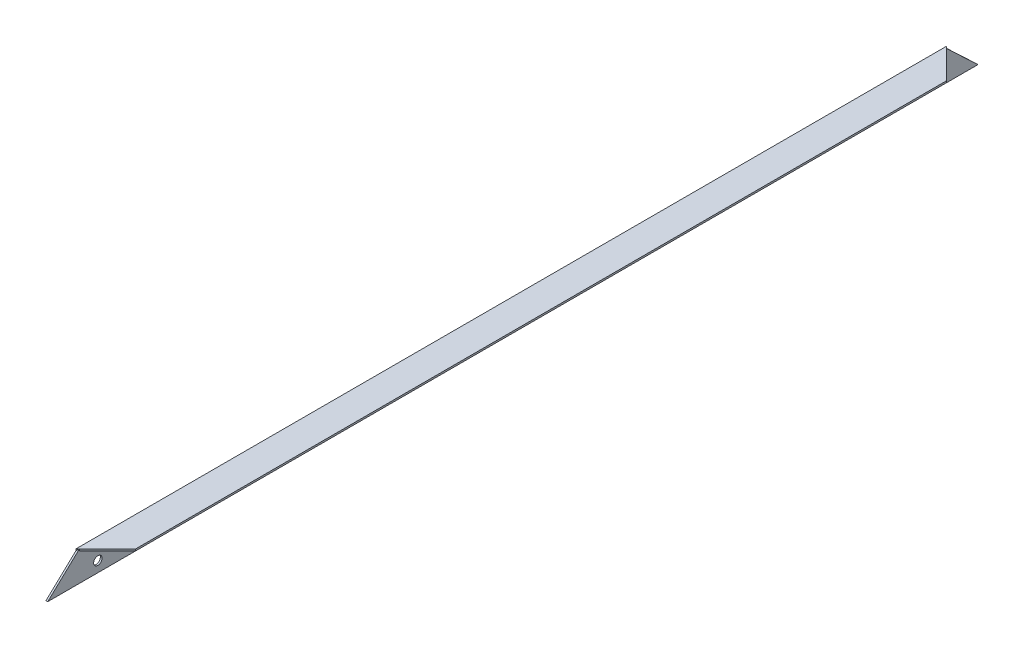
ISO-10303-21;
HEADER;
FILE_DESCRIPTION(('STEP AP214'),'2;1');
FILE_NAME('part.step','',(''),(''),'','','');
FILE_SCHEMA(('AUTOMOTIVE_DESIGN { 1 0 10303 214 1 1 1 1 }'));
ENDSEC;
DATA;
#1=APPLICATION_CONTEXT('core data for automotive mechanical design processes');
#2=APPLICATION_PROTOCOL_DEFINITION('international standard','automotive_design',2000,#1);
#3=PRODUCT_CONTEXT('',#1,'mechanical');
#4=PRODUCT('Part','Part','',(#3));
#5=PRODUCT_RELATED_PRODUCT_CATEGORY('part','',(#4));
#6=PRODUCT_DEFINITION_FORMATION('','',#4);
#7=PRODUCT_DEFINITION_CONTEXT('part definition',#1,'design');
#8=PRODUCT_DEFINITION('design','',#6,#7);
#9=PRODUCT_DEFINITION_SHAPE('','',#8);
#10=(LENGTH_UNIT() NAMED_UNIT(*) SI_UNIT(.MILLI.,.METRE.));
#11=(NAMED_UNIT(*) PLANE_ANGLE_UNIT() SI_UNIT($,.RADIAN.));
#12=(NAMED_UNIT(*) SI_UNIT($,.STERADIAN.) SOLID_ANGLE_UNIT());
#13=UNCERTAINTY_MEASURE_WITH_UNIT(LENGTH_MEASURE(1.E-05),#10,'distance_accuracy_value','');
#14=(GEOMETRIC_REPRESENTATION_CONTEXT(3) GLOBAL_UNCERTAINTY_ASSIGNED_CONTEXT((#13)) GLOBAL_UNIT_ASSIGNED_CONTEXT((#10,
#11,#12)) REPRESENTATION_CONTEXT('',''));
#15=CARTESIAN_POINT('',(0.,0.,0.));
#16=DIRECTION('',(0.,0.,1.));
#17=DIRECTION('',(1.,0.,0.));
#18=AXIS2_PLACEMENT_3D('',#15,#16,#17);
#19=CARTESIAN_POINT('',(-17.9063367596535,10.1835053553727,-618.75));
#20=DIRECTION('',(-0.707106781186547,0.,0.707106781186548));
#21=DIRECTION('',(0.707106781186548,0.,0.707106781186547));
#22=AXIS2_PLACEMENT_3D('',#19,#20,#21);
#23=PLANE('',#22);
#24=DIRECTION('',(0.,-1.,0.));
#25=VECTOR('',#24,1.);
#26=CARTESIAN_POINT('',(-15.4063367596535,20.1835053553728,-616.25));
#27=LINE('',#26,#25);
#28=CARTESIAN_POINT('',(-15.4063367596535,20.1835053553728,-616.25));
#29=VERTEX_POINT('',#28);
#30=CARTESIAN_POINT('',(-15.4063367596535,17.6835053553727,-616.25));
#31=VERTEX_POINT('',#30);
#32=EDGE_CURVE('E126',#29,#31,#27,.T.);
#33=ORIENTED_EDGE('',*,*,#32,.F.);
#34=DIRECTION('',(0.707106781186548,0.,0.707106781186547));
#35=VECTOR('',#34,1.);
#36=CARTESIAN_POINT('',(-17.9063367596535,20.1835053553727,-618.75));
#37=LINE('',#36,#35);
#38=CARTESIAN_POINT('',(24.5936632403465,20.1835053553727,-576.25));
#39=VERTEX_POINT('',#38);
#40=EDGE_CURVE('E144',#29,#39,#37,.T.);
#41=ORIENTED_EDGE('',*,*,#40,.T.);
#42=DIRECTION('',(0.,1.,0.));
#43=VECTOR('',#42,1.);
#44=CARTESIAN_POINT('',(24.5936632403465,10.1835053553728,-576.25));
#45=LINE('',#44,#43);
#46=CARTESIAN_POINT('',(24.5936632403465,17.6835053553727,-576.25));
#47=VERTEX_POINT('',#46);
#48=EDGE_CURVE('E58',#47,#39,#45,.T.);
#49=ORIENTED_EDGE('',*,*,#48,.F.);
#50=DIRECTION('',(0.707106781186548,0.,0.707106781186547));
#51=VECTOR('',#50,1.);
#52=CARTESIAN_POINT('',(602.093663240347,17.6835053553727,1.24999999999964));
#53=LINE('',#52,#51);
#54=EDGE_CURVE('E146',#31,#47,#53,.T.);
#55=ORIENTED_EDGE('',*,*,#54,.F.);
#56=EDGE_LOOP('',(#33,#41,#49,#55));
#57=FACE_BOUND('',#56,.T.);
#58=ADVANCED_FACE('F35',(#57),#23,.F.);
#59=CARTESIAN_POINT('',(-17.9063367596535,10.1835053553727,618.75));
#60=DIRECTION('',(-0.707106781186547,0.,-0.707106781186548));
#61=DIRECTION('',(-0.707106781186548,0.,0.707106781186547));
#62=AXIS2_PLACEMENT_3D('',#59,#60,#61);
#63=PLANE('',#62);
#64=DIRECTION('',(0.,-1.,0.));
#65=VECTOR('',#64,1.);
#66=CARTESIAN_POINT('',(-17.9063367596535,20.1835053553727,618.75));
#67=LINE('',#66,#65);
#68=CARTESIAN_POINT('',(-17.9063367596535,20.1835053553727,618.75));
#69=VERTEX_POINT('',#68);
#70=CARTESIAN_POINT('',(-17.9063367596535,17.8223942442616,618.75));
#71=VERTEX_POINT('',#70);
#72=EDGE_CURVE('E112',#69,#71,#67,.T.);
#73=ORIENTED_EDGE('',*,*,#72,.T.);
#74=DIRECTION('',(0.588034368346322,0.55536579232708,-0.588034368346322));
#75=VECTOR('',#74,1.);
#76=CARTESIAN_POINT('',(-20.4010005803579,15.4663228580408,621.244663820704));
#77=LINE('',#76,#75);
#78=CARTESIAN_POINT('',(-15.4063367596535,20.1835053553727,616.25));
#79=VERTEX_POINT('',#78);
#80=EDGE_CURVE('E43',#71,#79,#77,.T.);
#81=ORIENTED_EDGE('',*,*,#80,.T.);
#82=DIRECTION('',(-0.707106781186548,0.,0.707106781186547));
#83=VECTOR('',#82,1.);
#84=CARTESIAN_POINT('',(-17.9063367596535,20.1835053553727,618.75));
#85=LINE('',#84,#83);
#86=EDGE_CURVE('E140',#79,#69,#85,.T.);
#87=ORIENTED_EDGE('',*,*,#86,.T.);
#88=EDGE_LOOP('',(#73,#81,#87));
#89=FACE_BOUND('',#88,.T.);
#90=ADVANCED_FACE('F171',(#89),#63,.F.);
#91=CARTESIAN_POINT('',(-17.9063367596535,-22.3164946446273,618.75));
#92=DIRECTION('',(0.,1.,0.));
#93=DIRECTION('',(0.,0.,1.));
#94=AXIS2_PLACEMENT_3D('',#91,#92,#93);
#95=PLANE('',#94);
#96=DIRECTION('',(0.,0.,-1.));
#97=VECTOR('',#96,1.);
#98=CARTESIAN_POINT('',(-17.9063367596535,-22.3164946446273,618.75));
#99=LINE('',#98,#97);
#100=CARTESIAN_POINT('',(-17.9063367596535,-22.3164946446273,661.25));
#101=VERTEX_POINT('',#100);
#102=CARTESIAN_POINT('',(-17.9063367596535,-22.3164946446271,-661.25));
#103=VERTEX_POINT('',#102);
#104=EDGE_CURVE('E101',#101,#103,#99,.T.);
#105=ORIENTED_EDGE('',*,*,#104,.T.);
#106=DIRECTION('',(1.,0.,0.));
#107=VECTOR('',#106,1.);
#108=CARTESIAN_POINT('',(-17.9063367596535,-22.3164946446271,-661.25));
#109=LINE('',#108,#107);
#110=CARTESIAN_POINT('',(-15.4063367596535,-22.3164946446271,-661.25));
#111=VERTEX_POINT('',#110);
#112=EDGE_CURVE('E103',#103,#111,#109,.T.);
#113=ORIENTED_EDGE('',*,*,#112,.T.);
#114=DIRECTION('',(0.,0.,-1.));
#115=VECTOR('',#114,1.);
#116=CARTESIAN_POINT('',(-15.4063367596535,-22.3164946446273,618.75));
#117=LINE('',#116,#115);
#118=CARTESIAN_POINT('',(-15.4063367596535,-22.3164946446273,661.25));
#119=VERTEX_POINT('',#118);
#120=EDGE_CURVE('E167',#119,#111,#117,.T.);
#121=ORIENTED_EDGE('',*,*,#120,.F.);
#122=DIRECTION('',(1.,0.,0.));
#123=VECTOR('',#122,1.);
#124=CARTESIAN_POINT('',(-17.9063367596535,-22.3164946446273,661.25));
#125=LINE('',#124,#123);
#126=EDGE_CURVE('E106',#101,#119,#125,.T.);
#127=ORIENTED_EDGE('',*,*,#126,.F.);
#128=EDGE_LOOP('',(#105,#113,#121,#127));
#129=FACE_BOUND('',#128,.T.);
#130=ADVANCED_FACE('F37',(#129),#95,.F.);
#131=CARTESIAN_POINT('',(-15.4063367596535,-22.3164946446273,618.75));
#132=DIRECTION('',(-1.,0.,0.));
#133=DIRECTION('',(0.,-1.,0.));
#134=AXIS2_PLACEMENT_3D('',#131,#132,#133);
#135=PLANE('',#134);
#136=CARTESIAN_POINT('',(-15.4063367596535,-7.31649464462725,590.));
#137=DIRECTION('',(-1.,0.,0.));
#138=DIRECTION('',(0.,-1.,0.));
#139=AXIS2_PLACEMENT_3D('',#136,#137,#138);
#140=CIRCLE('',#139,5.99999999999999);
#141=CARTESIAN_POINT('',(-15.4063367596535,-13.3164946446272,590.));
#142=VERTEX_POINT('',#141);
#143=EDGE_CURVE('E130',#142,#142,#140,.T.);
#144=ORIENTED_EDGE('',*,*,#143,.T.);
#145=EDGE_LOOP('',(#144));
#146=FACE_BOUND('',#145,.T.);
#147=CARTESIAN_POINT('',(-15.4063367596535,-7.31649464462725,472.));
#148=DIRECTION('',(-1.,0.,0.));
#149=DIRECTION('',(0.,-1.,0.));
#150=AXIS2_PLACEMENT_3D('',#147,#148,#149);
#151=CIRCLE('',#150,5.99999999999999);
#152=CARTESIAN_POINT('',(-15.4063367596535,-13.3164946446272,472.));
#153=VERTEX_POINT('',#152);
#154=EDGE_CURVE('E236',#153,#153,#151,.T.);
#155=ORIENTED_EDGE('',*,*,#154,.T.);
#156=EDGE_LOOP('',(#155));
#157=FACE_BOUND('',#156,.T.);
#158=CARTESIAN_POINT('',(-15.4063367596535,-7.31649464462725,354.));
#159=DIRECTION('',(-1.,0.,0.));
#160=DIRECTION('',(0.,-1.,0.));
#161=AXIS2_PLACEMENT_3D('',#158,#159,#160);
#162=CIRCLE('',#161,5.99999999999999);
#163=CARTESIAN_POINT('',(-15.4063367596535,-13.3164946446272,354.));
#164=VERTEX_POINT('',#163);
#165=EDGE_CURVE('E240',#164,#164,#162,.T.);
#166=ORIENTED_EDGE('',*,*,#165,.T.);
#167=EDGE_LOOP('',(#166));
#168=FACE_BOUND('',#167,.T.);
#169=CARTESIAN_POINT('',(-15.4063367596535,-7.31649464462725,236.));
#170=DIRECTION('',(-1.,0.,0.));
#171=DIRECTION('',(0.,-1.,0.));
#172=AXIS2_PLACEMENT_3D('',#169,#170,#171);
#173=CIRCLE('',#172,5.99999999999999);
#174=CARTESIAN_POINT('',(-15.4063367596535,-13.3164946446272,236.));
#175=VERTEX_POINT('',#174);
#176=EDGE_CURVE('E244',#175,#175,#173,.T.);
#177=ORIENTED_EDGE('',*,*,#176,.T.);
#178=EDGE_LOOP('',(#177));
#179=FACE_BOUND('',#178,.T.);
#180=CARTESIAN_POINT('',(-15.4063367596535,-7.31649464462725,118.));
#181=DIRECTION('',(-1.,0.,0.));
#182=DIRECTION('',(0.,-1.,0.));
#183=AXIS2_PLACEMENT_3D('',#180,#181,#182);
#184=CIRCLE('',#183,5.99999999999999);
#185=CARTESIAN_POINT('',(-15.4063367596535,-13.3164946446272,118.));
#186=VERTEX_POINT('',#185);
#187=EDGE_CURVE('E248',#186,#186,#184,.T.);
#188=ORIENTED_EDGE('',*,*,#187,.T.);
#189=EDGE_LOOP('',(#188));
#190=FACE_BOUND('',#189,.T.);
#191=CARTESIAN_POINT('',(-15.4063367596535,-7.31649464462725,0.));
#192=DIRECTION('',(-1.,0.,0.));
#193=DIRECTION('',(0.,-1.,0.));
#194=AXIS2_PLACEMENT_3D('',#191,#192,#193);
#195=CIRCLE('',#194,5.99999999999999);
#196=CARTESIAN_POINT('',(-15.4063367596535,-13.3164946446272,0.));
#197=VERTEX_POINT('',#196);
#198=EDGE_CURVE('E252',#197,#197,#195,.T.);
#199=ORIENTED_EDGE('',*,*,#198,.T.);
#200=EDGE_LOOP('',(#199));
#201=FACE_BOUND('',#200,.T.);
#202=CARTESIAN_POINT('',(-15.4063367596535,-7.31649464462725,-118.));
#203=DIRECTION('',(-1.,0.,0.));
#204=DIRECTION('',(0.,-1.,0.));
#205=AXIS2_PLACEMENT_3D('',#202,#203,#204);
#206=CIRCLE('',#205,5.99999999999999);
#207=CARTESIAN_POINT('',(-15.4063367596535,-13.3164946446272,-118.));
#208=VERTEX_POINT('',#207);
#209=EDGE_CURVE('E256',#208,#208,#206,.T.);
#210=ORIENTED_EDGE('',*,*,#209,.T.);
#211=EDGE_LOOP('',(#210));
#212=FACE_BOUND('',#211,.T.);
#213=CARTESIAN_POINT('',(-15.4063367596535,-7.31649464462725,-236.));
#214=DIRECTION('',(-1.,0.,0.));
#215=DIRECTION('',(0.,-1.,0.));
#216=AXIS2_PLACEMENT_3D('',#213,#214,#215);
#217=CIRCLE('',#216,5.99999999999999);
#218=CARTESIAN_POINT('',(-15.4063367596535,-13.3164946446272,-236.));
#219=VERTEX_POINT('',#218);
#220=EDGE_CURVE('E260',#219,#219,#217,.T.);
#221=ORIENTED_EDGE('',*,*,#220,.T.);
#222=EDGE_LOOP('',(#221));
#223=FACE_BOUND('',#222,.T.);
#224=CARTESIAN_POINT('',(-15.4063367596535,-7.31649464462725,-354.));
#225=DIRECTION('',(-1.,0.,0.));
#226=DIRECTION('',(0.,-1.,0.));
#227=AXIS2_PLACEMENT_3D('',#224,#225,#226);
#228=CIRCLE('',#227,5.99999999999999);
#229=CARTESIAN_POINT('',(-15.4063367596535,-13.3164946446272,-354.));
#230=VERTEX_POINT('',#229);
#231=EDGE_CURVE('E264',#230,#230,#228,.T.);
#232=ORIENTED_EDGE('',*,*,#231,.T.);
#233=EDGE_LOOP('',(#232));
#234=FACE_BOUND('',#233,.T.);
#235=CARTESIAN_POINT('',(-15.4063367596535,-7.31649464462725,-472.));
#236=DIRECTION('',(-1.,0.,0.));
#237=DIRECTION('',(0.,-1.,0.));
#238=AXIS2_PLACEMENT_3D('',#235,#236,#237);
#239=CIRCLE('',#238,5.99999999999999);
#240=CARTESIAN_POINT('',(-15.4063367596535,-13.3164946446272,-472.));
#241=VERTEX_POINT('',#240);
#242=EDGE_CURVE('E268',#241,#241,#239,.T.);
#243=ORIENTED_EDGE('',*,*,#242,.T.);
#244=EDGE_LOOP('',(#243));
#245=FACE_BOUND('',#244,.T.);
#246=CARTESIAN_POINT('',(-15.4063367596535,-7.31649464462725,-590.));
#247=DIRECTION('',(-1.,0.,0.));
#248=DIRECTION('',(0.,-1.,0.));
#249=AXIS2_PLACEMENT_3D('',#246,#247,#248);
#250=CIRCLE('',#249,5.99999999999999);
#251=CARTESIAN_POINT('',(-15.4063367596535,-13.3164946446272,-590.));
#252=VERTEX_POINT('',#251);
#253=EDGE_CURVE('E271',#252,#252,#250,.T.);
#254=ORIENTED_EDGE('',*,*,#253,.T.);
#255=EDGE_LOOP('',(#254));
#256=FACE_BOUND('',#255,.T.);
#257=ORIENTED_EDGE('',*,*,#120,.T.);
#258=DIRECTION('',(0.,0.686623532963715,0.727013152549818));
#259=VECTOR('',#258,1.);
#260=CARTESIAN_POINT('',(-15.4063367596535,20.1835053553728,-616.25));
#261=LINE('',#260,#259);
#262=EDGE_CURVE('E118',#111,#29,#261,.T.);
#263=ORIENTED_EDGE('',*,*,#262,.T.);
#264=ORIENTED_EDGE('',*,*,#32,.T.);
#265=DIRECTION('',(0.,0.,-1.));
#266=VECTOR('',#265,1.);
#267=CARTESIAN_POINT('',(-15.4063367596535,17.6835053553727,618.75));
#268=LINE('',#267,#266);
#269=CARTESIAN_POINT('',(-15.4063367596535,17.6835053553727,616.25));
#270=VERTEX_POINT('',#269);
#271=EDGE_CURVE('E164',#270,#31,#268,.T.);
#272=ORIENTED_EDGE('',*,*,#271,.F.);
#273=DIRECTION('',(0.,1.,0.));
#274=VECTOR('',#273,1.);
#275=CARTESIAN_POINT('',(-15.4063367596535,20.1835053553727,616.25));
#276=LINE('',#275,#274);
#277=EDGE_CURVE('E119',#270,#79,#276,.T.);
#278=ORIENTED_EDGE('',*,*,#277,.T.);
#279=DIRECTION('',(0.,-0.686623532963716,0.727013152549818));
#280=VECTOR('',#279,1.);
#281=CARTESIAN_POINT('',(-15.4063367596535,20.1835053553727,616.25));
#282=LINE('',#281,#280);
#283=EDGE_CURVE('E135',#79,#119,#282,.T.);
#284=ORIENTED_EDGE('',*,*,#283,.T.);
#285=EDGE_LOOP('',(#257,#263,#264,#272,#278,#284));
#286=FACE_BOUND('',#285,.T.);
#287=ADVANCED_FACE('F193',(#146,#157,#168,#179,#190,#201,#212,#223,#234,#245,#256,#286),#135,.F.);
#288=CARTESIAN_POINT('',(-15.4063367596535,17.6835053553727,618.75));
#289=DIRECTION('',(0.,1.,0.));
#290=DIRECTION('',(0.,0.,1.));
#291=AXIS2_PLACEMENT_3D('',#288,#289,#290);
#292=PLANE('',#291);
#293=ORIENTED_EDGE('',*,*,#271,.T.);
#294=ORIENTED_EDGE('',*,*,#54,.T.);
#295=DIRECTION('',(0.,0.,-1.));
#296=VECTOR('',#295,1.);
#297=CARTESIAN_POINT('',(24.5936632403465,17.6835053553727,618.75));
#298=LINE('',#297,#296);
#299=CARTESIAN_POINT('',(24.5936632403465,17.6835053553727,576.25));
#300=VERTEX_POINT('',#299);
#301=EDGE_CURVE('E161',#300,#47,#298,.T.);
#302=ORIENTED_EDGE('',*,*,#301,.F.);
#303=DIRECTION('',(-0.707106781186548,0.,0.707106781186547));
#304=VECTOR('',#303,1.);
#305=CARTESIAN_POINT('',(-16.6563367596535,17.6835053553727,617.5));
#306=LINE('',#305,#304);
#307=EDGE_CURVE('E50',#300,#270,#306,.T.);
#308=ORIENTED_EDGE('',*,*,#307,.T.);
#309=EDGE_LOOP('',(#293,#294,#302,#308));
#310=FACE_BOUND('',#309,.T.);
#311=ADVANCED_FACE('F186',(#310),#292,.F.);
#312=CARTESIAN_POINT('',(24.5936632403465,17.6835053553727,618.75));
#313=DIRECTION('',(-1.,0.,0.));
#314=DIRECTION('',(0.,0.,1.));
#315=AXIS2_PLACEMENT_3D('',#312,#313,#314);
#316=PLANE('',#315);
#317=ORIENTED_EDGE('',*,*,#301,.T.);
#318=ORIENTED_EDGE('',*,*,#48,.T.);
#319=DIRECTION('',(0.,0.,-1.));
#320=VECTOR('',#319,1.);
#321=CARTESIAN_POINT('',(24.5936632403465,20.1835053553727,618.75));
#322=LINE('',#321,#320);
#323=CARTESIAN_POINT('',(24.5936632403465,20.1835053553727,576.25));
#324=VERTEX_POINT('',#323);
#325=EDGE_CURVE('E158',#324,#39,#322,.T.);
#326=ORIENTED_EDGE('',*,*,#325,.F.);
#327=DIRECTION('',(0.,1.,0.));
#328=VECTOR('',#327,1.);
#329=CARTESIAN_POINT('',(24.5936632403465,10.1835053553728,576.25));
#330=LINE('',#329,#328);
#331=EDGE_CURVE('E150',#300,#324,#330,.T.);
#332=ORIENTED_EDGE('',*,*,#331,.F.);
#333=EDGE_LOOP('',(#317,#318,#326,#332));
#334=FACE_BOUND('',#333,.T.);
#335=ADVANCED_FACE('F184',(#334),#316,.F.);
#336=CARTESIAN_POINT('',(24.5936632403465,20.1835053553727,618.75));
#337=DIRECTION('',(0.,-1.,0.));
#338=DIRECTION('',(1.,0.,0.));
#339=AXIS2_PLACEMENT_3D('',#336,#337,#338);
#340=PLANE('',#339);
#341=CARTESIAN_POINT('',(-17.9063367596535,20.1835053553727,-618.75));
#342=VERTEX_POINT('',#341);
#343=EDGE_CURVE('E141',#342,#29,#37,.T.);
#344=ORIENTED_EDGE('',*,*,#343,.F.);
#345=DIRECTION('',(0.,0.,-1.));
#346=VECTOR('',#345,1.);
#347=CARTESIAN_POINT('',(-17.9063367596535,20.1835053553727,618.75));
#348=LINE('',#347,#346);
#349=EDGE_CURVE('E111',#69,#342,#348,.T.);
#350=ORIENTED_EDGE('',*,*,#349,.F.);
#351=ORIENTED_EDGE('',*,*,#86,.F.);
#352=EDGE_CURVE('E147',#324,#79,#85,.T.);
#353=ORIENTED_EDGE('',*,*,#352,.F.);
#354=ORIENTED_EDGE('',*,*,#325,.T.);
#355=ORIENTED_EDGE('',*,*,#40,.F.);
#356=EDGE_LOOP('',(#344,#350,#351,#353,#354,#355));
#357=FACE_BOUND('',#356,.T.);
#358=ADVANCED_FACE('F179',(#357),#340,.F.);
#359=CARTESIAN_POINT('',(-17.9063367596535,20.1835053553727,618.75));
#360=DIRECTION('',(1.,0.,0.));
#361=DIRECTION('',(0.,1.,0.));
#362=AXIS2_PLACEMENT_3D('',#359,#360,#361);
#363=PLANE('',#362);
#364=CARTESIAN_POINT('',(-17.9063367596535,-7.31649464462725,590.));
#365=DIRECTION('',(1.,0.,0.));
#366=DIRECTION('',(0.,1.,0.));
#367=AXIS2_PLACEMENT_3D('',#364,#365,#366);
#368=CIRCLE('',#367,5.99999999999999);
#369=CARTESIAN_POINT('',(-17.9063367596535,-1.31649464462726,590.));
#370=VERTEX_POINT('',#369);
#371=EDGE_CURVE('E273',#370,#370,#368,.T.);
#372=ORIENTED_EDGE('',*,*,#371,.T.);
#373=EDGE_LOOP('',(#372));
#374=FACE_BOUND('',#373,.T.);
#375=CARTESIAN_POINT('',(-17.9063367596535,-7.31649464462725,472.));
#376=DIRECTION('',(1.,0.,0.));
#377=DIRECTION('',(0.,1.,0.));
#378=AXIS2_PLACEMENT_3D('',#375,#376,#377);
#379=CIRCLE('',#378,5.99999999999999);
#380=CARTESIAN_POINT('',(-17.9063367596535,-1.31649464462726,472.));
#381=VERTEX_POINT('',#380);
#382=EDGE_CURVE('E276',#381,#381,#379,.T.);
#383=ORIENTED_EDGE('',*,*,#382,.T.);
#384=EDGE_LOOP('',(#383));
#385=FACE_BOUND('',#384,.T.);
#386=CARTESIAN_POINT('',(-17.9063367596535,-7.31649464462725,354.));
#387=DIRECTION('',(1.,0.,0.));
#388=DIRECTION('',(0.,1.,0.));
#389=AXIS2_PLACEMENT_3D('',#386,#387,#388);
#390=CIRCLE('',#389,5.99999999999999);
#391=CARTESIAN_POINT('',(-17.9063367596535,-1.31649464462726,354.));
#392=VERTEX_POINT('',#391);
#393=EDGE_CURVE('E310',#392,#392,#390,.T.);
#394=ORIENTED_EDGE('',*,*,#393,.T.);
#395=EDGE_LOOP('',(#394));
#396=FACE_BOUND('',#395,.T.);
#397=CARTESIAN_POINT('',(-17.9063367596535,-7.31649464462725,236.));
#398=DIRECTION('',(1.,0.,0.));
#399=DIRECTION('',(0.,1.,0.));
#400=AXIS2_PLACEMENT_3D('',#397,#398,#399);
#401=CIRCLE('',#400,5.99999999999999);
#402=CARTESIAN_POINT('',(-17.9063367596535,-1.31649464462726,236.));
#403=VERTEX_POINT('',#402);
#404=EDGE_CURVE('E307',#403,#403,#401,.T.);
#405=ORIENTED_EDGE('',*,*,#404,.T.);
#406=EDGE_LOOP('',(#405));
#407=FACE_BOUND('',#406,.T.);
#408=CARTESIAN_POINT('',(-17.9063367596535,-7.31649464462725,118.));
#409=DIRECTION('',(1.,0.,0.));
#410=DIRECTION('',(0.,1.,0.));
#411=AXIS2_PLACEMENT_3D('',#408,#409,#410);
#412=CIRCLE('',#411,5.99999999999999);
#413=CARTESIAN_POINT('',(-17.9063367596535,-1.31649464462726,118.));
#414=VERTEX_POINT('',#413);
#415=EDGE_CURVE('E304',#414,#414,#412,.T.);
#416=ORIENTED_EDGE('',*,*,#415,.T.);
#417=EDGE_LOOP('',(#416));
#418=FACE_BOUND('',#417,.T.);
#419=CARTESIAN_POINT('',(-17.9063367596535,-7.31649464462725,0.));
#420=DIRECTION('',(1.,0.,0.));
#421=DIRECTION('',(0.,1.,0.));
#422=AXIS2_PLACEMENT_3D('',#419,#420,#421);
#423=CIRCLE('',#422,5.99999999999999);
#424=CARTESIAN_POINT('',(-17.9063367596535,-1.31649464462726,0.));
#425=VERTEX_POINT('',#424);
#426=EDGE_CURVE('E301',#425,#425,#423,.T.);
#427=ORIENTED_EDGE('',*,*,#426,.T.);
#428=EDGE_LOOP('',(#427));
#429=FACE_BOUND('',#428,.T.);
#430=CARTESIAN_POINT('',(-17.9063367596535,-7.31649464462725,-118.));
#431=DIRECTION('',(1.,0.,0.));
#432=DIRECTION('',(0.,1.,0.));
#433=AXIS2_PLACEMENT_3D('',#430,#431,#432);
#434=CIRCLE('',#433,5.99999999999999);
#435=CARTESIAN_POINT('',(-17.9063367596535,-1.31649464462726,-118.));
#436=VERTEX_POINT('',#435);
#437=EDGE_CURVE('E298',#436,#436,#434,.T.);
#438=ORIENTED_EDGE('',*,*,#437,.T.);
#439=EDGE_LOOP('',(#438));
#440=FACE_BOUND('',#439,.T.);
#441=CARTESIAN_POINT('',(-17.9063367596535,-7.31649464462725,-236.));
#442=DIRECTION('',(1.,0.,0.));
#443=DIRECTION('',(0.,1.,0.));
#444=AXIS2_PLACEMENT_3D('',#441,#442,#443);
#445=CIRCLE('',#444,5.99999999999999);
#446=CARTESIAN_POINT('',(-17.9063367596535,-1.31649464462726,-236.));
#447=VERTEX_POINT('',#446);
#448=EDGE_CURVE('E295',#447,#447,#445,.T.);
#449=ORIENTED_EDGE('',*,*,#448,.T.);
#450=EDGE_LOOP('',(#449));
#451=FACE_BOUND('',#450,.T.);
#452=CARTESIAN_POINT('',(-17.9063367596535,-7.31649464462725,-354.));
#453=DIRECTION('',(1.,0.,0.));
#454=DIRECTION('',(0.,1.,0.));
#455=AXIS2_PLACEMENT_3D('',#452,#453,#454);
#456=CIRCLE('',#455,5.99999999999999);
#457=CARTESIAN_POINT('',(-17.9063367596535,-1.31649464462726,-354.));
#458=VERTEX_POINT('',#457);
#459=EDGE_CURVE('E292',#458,#458,#456,.T.);
#460=ORIENTED_EDGE('',*,*,#459,.T.);
#461=EDGE_LOOP('',(#460));
#462=FACE_BOUND('',#461,.T.);
#463=CARTESIAN_POINT('',(-17.9063367596535,-7.31649464462725,-472.));
#464=DIRECTION('',(1.,0.,0.));
#465=DIRECTION('',(0.,1.,0.));
#466=AXIS2_PLACEMENT_3D('',#463,#464,#465);
#467=CIRCLE('',#466,5.99999999999999);
#468=CARTESIAN_POINT('',(-17.9063367596535,-1.31649464462726,-472.));
#469=VERTEX_POINT('',#468);
#470=EDGE_CURVE('E289',#469,#469,#467,.T.);
#471=ORIENTED_EDGE('',*,*,#470,.T.);
#472=EDGE_LOOP('',(#471));
#473=FACE_BOUND('',#472,.T.);
#474=CARTESIAN_POINT('',(-17.9063367596535,-7.31649464462725,-590.));
#475=DIRECTION('',(1.,0.,0.));
#476=DIRECTION('',(0.,1.,0.));
#477=AXIS2_PLACEMENT_3D('',#474,#475,#476);
#478=CIRCLE('',#477,5.99999999999999);
#479=CARTESIAN_POINT('',(-17.9063367596535,-1.31649464462726,-590.));
#480=VERTEX_POINT('',#479);
#481=EDGE_CURVE('E279',#480,#480,#478,.T.);
#482=ORIENTED_EDGE('',*,*,#481,.T.);
#483=EDGE_LOOP('',(#482));
#484=FACE_BOUND('',#483,.T.);
#485=DIRECTION('',(0.,-1.,0.));
#486=VECTOR('',#485,1.);
#487=CARTESIAN_POINT('',(-17.9063367596535,20.1835053553727,-618.75));
#488=LINE('',#487,#486);
#489=CARTESIAN_POINT('',(-17.9063367596535,17.8223942442618,-618.75));
#490=VERTEX_POINT('',#489);
#491=EDGE_CURVE('E124',#342,#490,#488,.T.);
#492=ORIENTED_EDGE('',*,*,#491,.T.);
#493=DIRECTION('',(0.,0.686623532963715,0.727013152549818));
#494=VECTOR('',#493,1.);
#495=CARTESIAN_POINT('',(-17.9063367596535,20.1835053553728,-616.25));
#496=LINE('',#495,#494);
#497=EDGE_CURVE('E116',#103,#490,#496,.T.);
#498=ORIENTED_EDGE('',*,*,#497,.F.);
#499=ORIENTED_EDGE('',*,*,#104,.F.);
#500=DIRECTION('',(0.,-0.686623532963716,0.727013152549818));
#501=VECTOR('',#500,1.);
#502=CARTESIAN_POINT('',(-17.9063367596535,20.1835053553727,616.25));
#503=LINE('',#502,#501);
#504=EDGE_CURVE('E133',#71,#101,#503,.T.);
#505=ORIENTED_EDGE('',*,*,#504,.F.);
#506=ORIENTED_EDGE('',*,*,#72,.F.);
#507=ORIENTED_EDGE('',*,*,#349,.T.);
#508=EDGE_LOOP('',(#492,#498,#499,#505,#506,#507));
#509=FACE_BOUND('',#508,.T.);
#510=ADVANCED_FACE('F122',(#374,#385,#396,#407,#418,#429,#440,#451,#462,#473,#484,#509),#363,.F.);
#511=ORIENTED_EDGE('',*,*,#343,.T.);
#512=DIRECTION('',(-0.588034368346322,-0.55536579232708,-0.588034368346322));
#513=VECTOR('',#512,1.);
#514=CARTESIAN_POINT('',(-20.4010005803579,15.4663228580409,-621.244663820704));
#515=LINE('',#514,#513);
#516=EDGE_CURVE('E11',#29,#490,#515,.T.);
#517=ORIENTED_EDGE('',*,*,#516,.T.);
#518=ORIENTED_EDGE('',*,*,#491,.F.);
#519=EDGE_LOOP('',(#511,#517,#518));
#520=FACE_BOUND('',#519,.T.);
#521=ADVANCED_FACE('F192',(#520),#23,.F.);
#522=ORIENTED_EDGE('',*,*,#352,.T.);
#523=ORIENTED_EDGE('',*,*,#277,.F.);
#524=ORIENTED_EDGE('',*,*,#307,.F.);
#525=ORIENTED_EDGE('',*,*,#331,.T.);
#526=EDGE_LOOP('',(#522,#523,#524,#525));
#527=FACE_BOUND('',#526,.T.);
#528=ADVANCED_FACE('F181',(#527),#63,.F.);
#529=CARTESIAN_POINT('',(-17.9063367596535,20.1835053553727,616.25));
#530=DIRECTION('',(0.,0.727013152549818,0.686623532963716));
#531=DIRECTION('',(0.,-0.686623532963716,0.727013152549818));
#532=AXIS2_PLACEMENT_3D('',#529,#530,#531);
#533=PLANE('',#532);
#534=ORIENTED_EDGE('',*,*,#80,.F.);
#535=ORIENTED_EDGE('',*,*,#504,.T.);
#536=ORIENTED_EDGE('',*,*,#126,.T.);
#537=ORIENTED_EDGE('',*,*,#283,.F.);
#538=EDGE_LOOP('',(#534,#535,#536,#537));
#539=FACE_BOUND('',#538,.T.);
#540=ADVANCED_FACE('F194',(#539),#533,.T.);
#541=CARTESIAN_POINT('',(-17.9063367596535,20.1835053553728,-616.25));
#542=DIRECTION('',(0.,0.727013152549818,-0.686623532963715));
#543=DIRECTION('',(0.,0.686623532963715,0.727013152549818));
#544=AXIS2_PLACEMENT_3D('',#541,#542,#543);
#545=PLANE('',#544);
#546=ORIENTED_EDGE('',*,*,#516,.F.);
#547=ORIENTED_EDGE('',*,*,#262,.F.);
#548=ORIENTED_EDGE('',*,*,#112,.F.);
#549=ORIENTED_EDGE('',*,*,#497,.T.);
#550=EDGE_LOOP('',(#546,#547,#548,#549));
#551=FACE_BOUND('',#550,.T.);
#552=ADVANCED_FACE('F115',(#551),#545,.T.);
#553=CARTESIAN_POINT('',(-17.9063367596535,-7.31649464462725,-590.));
#554=DIRECTION('',(1.,0.,0.));
#555=DIRECTION('',(0.,1.,0.));
#556=AXIS2_PLACEMENT_3D('',#553,#554,#555);
#557=CYLINDRICAL_SURFACE('',#556,5.99999999999999);
#558=ORIENTED_EDGE('',*,*,#481,.F.);
#559=EDGE_LOOP('',(#558));
#560=FACE_BOUND('',#559,.T.);
#561=ORIENTED_EDGE('',*,*,#253,.F.);
#562=EDGE_LOOP('',(#561));
#563=FACE_BOUND('',#562,.T.);
#564=ADVANCED_FACE('F201',(#560,#563),#557,.F.);
#565=CARTESIAN_POINT('',(-17.9063367596535,-7.31649464462725,-472.));
#566=DIRECTION('',(1.,0.,0.));
#567=DIRECTION('',(0.,1.,0.));
#568=AXIS2_PLACEMENT_3D('',#565,#566,#567);
#569=CYLINDRICAL_SURFACE('',#568,5.99999999999999);
#570=ORIENTED_EDGE('',*,*,#470,.F.);
#571=EDGE_LOOP('',(#570));
#572=FACE_BOUND('',#571,.T.);
#573=ORIENTED_EDGE('',*,*,#242,.F.);
#574=EDGE_LOOP('',(#573));
#575=FACE_BOUND('',#574,.T.);
#576=ADVANCED_FACE('F355',(#572,#575),#569,.F.);
#577=CARTESIAN_POINT('',(-17.9063367596535,-7.31649464462725,-354.));
#578=DIRECTION('',(1.,0.,0.));
#579=DIRECTION('',(0.,1.,0.));
#580=AXIS2_PLACEMENT_3D('',#577,#578,#579);
#581=CYLINDRICAL_SURFACE('',#580,5.99999999999999);
#582=ORIENTED_EDGE('',*,*,#459,.F.);
#583=EDGE_LOOP('',(#582));
#584=FACE_BOUND('',#583,.T.);
#585=ORIENTED_EDGE('',*,*,#231,.F.);
#586=EDGE_LOOP('',(#585));
#587=FACE_BOUND('',#586,.T.);
#588=ADVANCED_FACE('F351',(#584,#587),#581,.F.);
#589=CARTESIAN_POINT('',(-17.9063367596535,-7.31649464462725,-236.));
#590=DIRECTION('',(1.,0.,0.));
#591=DIRECTION('',(0.,1.,0.));
#592=AXIS2_PLACEMENT_3D('',#589,#590,#591);
#593=CYLINDRICAL_SURFACE('',#592,5.99999999999999);
#594=ORIENTED_EDGE('',*,*,#448,.F.);
#595=EDGE_LOOP('',(#594));
#596=FACE_BOUND('',#595,.T.);
#597=ORIENTED_EDGE('',*,*,#220,.F.);
#598=EDGE_LOOP('',(#597));
#599=FACE_BOUND('',#598,.T.);
#600=ADVANCED_FACE('F347',(#596,#599),#593,.F.);
#601=CARTESIAN_POINT('',(-17.9063367596535,-7.31649464462725,-118.));
#602=DIRECTION('',(1.,0.,0.));
#603=DIRECTION('',(0.,1.,0.));
#604=AXIS2_PLACEMENT_3D('',#601,#602,#603);
#605=CYLINDRICAL_SURFACE('',#604,5.99999999999999);
#606=ORIENTED_EDGE('',*,*,#437,.F.);
#607=EDGE_LOOP('',(#606));
#608=FACE_BOUND('',#607,.T.);
#609=ORIENTED_EDGE('',*,*,#209,.F.);
#610=EDGE_LOOP('',(#609));
#611=FACE_BOUND('',#610,.T.);
#612=ADVANCED_FACE('F343',(#608,#611),#605,.F.);
#613=CARTESIAN_POINT('',(-17.9063367596535,-7.31649464462725,0.));
#614=DIRECTION('',(1.,0.,0.));
#615=DIRECTION('',(0.,1.,0.));
#616=AXIS2_PLACEMENT_3D('',#613,#614,#615);
#617=CYLINDRICAL_SURFACE('',#616,5.99999999999999);
#618=ORIENTED_EDGE('',*,*,#426,.F.);
#619=EDGE_LOOP('',(#618));
#620=FACE_BOUND('',#619,.T.);
#621=ORIENTED_EDGE('',*,*,#198,.F.);
#622=EDGE_LOOP('',(#621));
#623=FACE_BOUND('',#622,.T.);
#624=ADVANCED_FACE('F339',(#620,#623),#617,.F.);
#625=CARTESIAN_POINT('',(-17.9063367596535,-7.31649464462725,118.));
#626=DIRECTION('',(1.,0.,0.));
#627=DIRECTION('',(0.,1.,0.));
#628=AXIS2_PLACEMENT_3D('',#625,#626,#627);
#629=CYLINDRICAL_SURFACE('',#628,5.99999999999999);
#630=ORIENTED_EDGE('',*,*,#415,.F.);
#631=EDGE_LOOP('',(#630));
#632=FACE_BOUND('',#631,.T.);
#633=ORIENTED_EDGE('',*,*,#187,.F.);
#634=EDGE_LOOP('',(#633));
#635=FACE_BOUND('',#634,.T.);
#636=ADVANCED_FACE('F335',(#632,#635),#629,.F.);
#637=CARTESIAN_POINT('',(-17.9063367596535,-7.31649464462725,236.));
#638=DIRECTION('',(1.,0.,0.));
#639=DIRECTION('',(0.,1.,0.));
#640=AXIS2_PLACEMENT_3D('',#637,#638,#639);
#641=CYLINDRICAL_SURFACE('',#640,5.99999999999999);
#642=ORIENTED_EDGE('',*,*,#404,.F.);
#643=EDGE_LOOP('',(#642));
#644=FACE_BOUND('',#643,.T.);
#645=ORIENTED_EDGE('',*,*,#176,.F.);
#646=EDGE_LOOP('',(#645));
#647=FACE_BOUND('',#646,.T.);
#648=ADVANCED_FACE('F329',(#644,#647),#641,.F.);
#649=CARTESIAN_POINT('',(-17.9063367596535,-7.31649464462725,354.));
#650=DIRECTION('',(1.,0.,0.));
#651=DIRECTION('',(0.,1.,0.));
#652=AXIS2_PLACEMENT_3D('',#649,#650,#651);
#653=CYLINDRICAL_SURFACE('',#652,5.99999999999999);
#654=ORIENTED_EDGE('',*,*,#393,.F.);
#655=EDGE_LOOP('',(#654));
#656=FACE_BOUND('',#655,.T.);
#657=ORIENTED_EDGE('',*,*,#165,.F.);
#658=EDGE_LOOP('',(#657));
#659=FACE_BOUND('',#658,.T.);
#660=ADVANCED_FACE('F321',(#656,#659),#653,.F.);
#661=CARTESIAN_POINT('',(-17.9063367596535,-7.31649464462725,472.));
#662=DIRECTION('',(1.,0.,0.));
#663=DIRECTION('',(0.,1.,0.));
#664=AXIS2_PLACEMENT_3D('',#661,#662,#663);
#665=CYLINDRICAL_SURFACE('',#664,5.99999999999999);
#666=ORIENTED_EDGE('',*,*,#382,.F.);
#667=EDGE_LOOP('',(#666));
#668=FACE_BOUND('',#667,.T.);
#669=ORIENTED_EDGE('',*,*,#154,.F.);
#670=EDGE_LOOP('',(#669));
#671=FACE_BOUND('',#670,.T.);
#672=ADVANCED_FACE('F317',(#668,#671),#665,.F.);
#673=CARTESIAN_POINT('',(-17.9063367596535,-7.31649464462725,590.));
#674=DIRECTION('',(1.,0.,0.));
#675=DIRECTION('',(0.,1.,0.));
#676=AXIS2_PLACEMENT_3D('',#673,#674,#675);
#677=CYLINDRICAL_SURFACE('',#676,5.99999999999999);
#678=ORIENTED_EDGE('',*,*,#371,.F.);
#679=EDGE_LOOP('',(#678));
#680=FACE_BOUND('',#679,.T.);
#681=ORIENTED_EDGE('',*,*,#143,.F.);
#682=EDGE_LOOP('',(#681));
#683=FACE_BOUND('',#682,.T.);
#684=ADVANCED_FACE('F320',(#680,#683),#677,.F.);
#685=CLOSED_SHELL('',(#58,#90,#130,#287,#311,#335,#358,#510,#521,#528,#540,#552,#564,#576,#588,
#600,#612,#624,#636,#648,#660,#672,#684));
#686=MANIFOLD_SOLID_BREP('B2',#685);
#687=ADVANCED_BREP_SHAPE_REPRESENTATION('',(#18,#686),#14);
#688=SHAPE_DEFINITION_REPRESENTATION(#9,#687);
ENDSEC;
END-ISO-10303-21;
